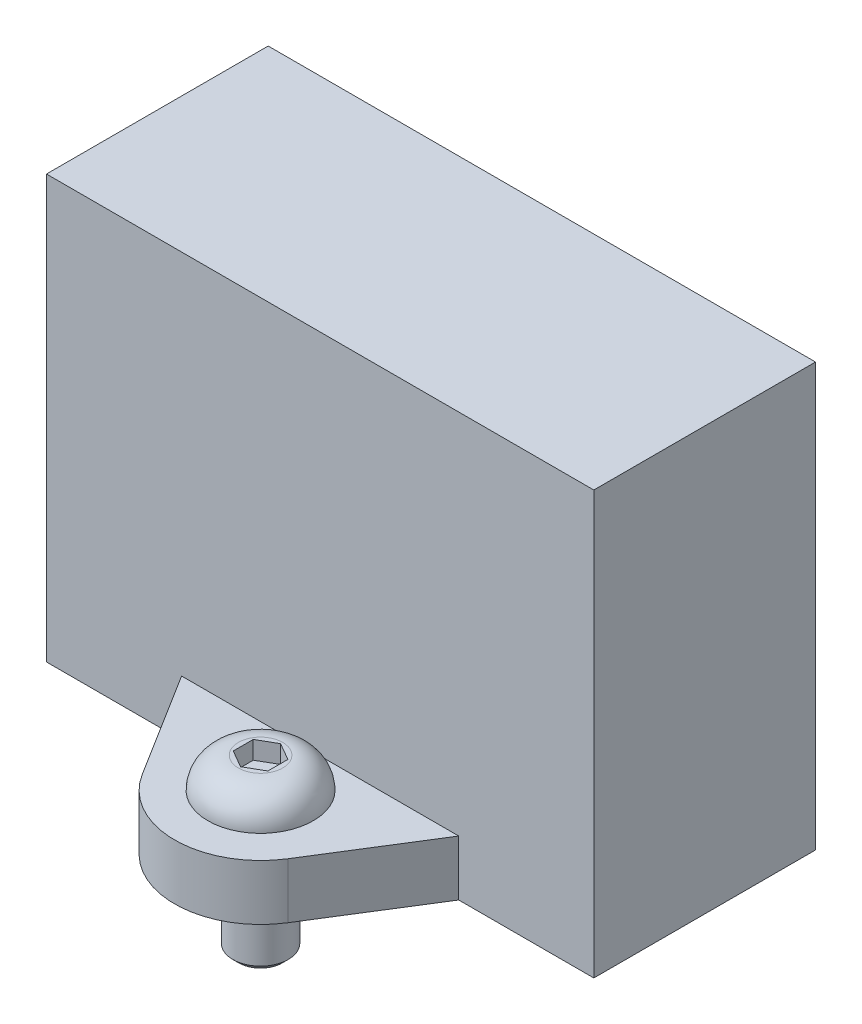
ISO-10303-21;
HEADER;
FILE_DESCRIPTION(('STEP AP214'),'2;1');
FILE_NAME('part.step','',(''),(''),'','','');
FILE_SCHEMA(('AUTOMOTIVE_DESIGN { 1 0 10303 214 1 1 1 1 }'));
ENDSEC;
DATA;
#1=APPLICATION_CONTEXT('core data for automotive mechanical design processes');
#2=APPLICATION_PROTOCOL_DEFINITION('international standard','automotive_design',2000,#1);
#3=PRODUCT_CONTEXT('',#1,'mechanical');
#4=PRODUCT('Part','Part','',(#3));
#5=PRODUCT_RELATED_PRODUCT_CATEGORY('part','',(#4));
#6=PRODUCT_DEFINITION_FORMATION('','',#4);
#7=PRODUCT_DEFINITION_CONTEXT('part definition',#1,'design');
#8=PRODUCT_DEFINITION('design','',#6,#7);
#9=PRODUCT_DEFINITION_SHAPE('','',#8);
#10=(LENGTH_UNIT() NAMED_UNIT(*) SI_UNIT(.MILLI.,.METRE.));
#11=(NAMED_UNIT(*) PLANE_ANGLE_UNIT() SI_UNIT($,.RADIAN.));
#12=(NAMED_UNIT(*) SI_UNIT($,.STERADIAN.) SOLID_ANGLE_UNIT());
#13=UNCERTAINTY_MEASURE_WITH_UNIT(LENGTH_MEASURE(1.E-05),#10,'distance_accuracy_value','');
#14=(GEOMETRIC_REPRESENTATION_CONTEXT(3) GLOBAL_UNCERTAINTY_ASSIGNED_CONTEXT((#13)) GLOBAL_UNIT_ASSIGNED_CONTEXT((#10,
#11,#12)) REPRESENTATION_CONTEXT('',''));
#15=CARTESIAN_POINT('',(0.,0.,0.));
#16=DIRECTION('',(0.,0.,1.));
#17=DIRECTION('',(1.,0.,0.));
#18=AXIS2_PLACEMENT_3D('',#15,#16,#17);
#19=CARTESIAN_POINT('',(0.,4.,4.3));
#20=DIRECTION('',(0.,1.,0.));
#21=DIRECTION('',(0.,0.,1.));
#22=AXIS2_PLACEMENT_3D('',#19,#20,#21);
#23=PLANE('',#22);
#24=DIRECTION('',(-1.,0.,0.));
#25=VECTOR('',#24,1.);
#26=CARTESIAN_POINT('',(10.,4.,0.));
#27=LINE('',#26,#25);
#28=CARTESIAN_POINT('',(10.,4.,0.));
#29=VERTEX_POINT('',#28);
#30=CARTESIAN_POINT('',(-10.,4.,0.));
#31=VERTEX_POINT('',#30);
#32=EDGE_CURVE('E218',#29,#31,#27,.T.);
#33=ORIENTED_EDGE('',*,*,#32,.T.);
#34=DIRECTION('',(0.530092544381419,0.,0.84793979408401));
#35=VECTOR('',#34,1.);
#36=CARTESIAN_POINT('',(-10.,4.,0.));
#37=LINE('',#36,#35);
#38=CARTESIAN_POINT('',(-5.25722672332086,4.,7.5865737751648));
#39=VERTEX_POINT('',#38);
#40=EDGE_CURVE('E221',#31,#39,#37,.T.);
#41=ORIENTED_EDGE('',*,*,#40,.T.);
#42=CARTESIAN_POINT('',(0.,4.,4.3));
#43=DIRECTION('',(0.,1.,0.));
#44=DIRECTION('',(0.,0.,1.));
#45=AXIS2_PLACEMENT_3D('',#42,#43,#44);
#46=CIRCLE('',#45,6.2);
#47=CARTESIAN_POINT('',(5.25722672332086,4.,7.5865737751648));
#48=VERTEX_POINT('',#47);
#49=EDGE_CURVE('E223',#39,#48,#46,.T.);
#50=ORIENTED_EDGE('',*,*,#49,.T.);
#51=DIRECTION('',(0.530092544381419,0.,-0.84793979408401));
#52=VECTOR('',#51,1.);
#53=CARTESIAN_POINT('',(5.25722672332086,4.,7.5865737751648));
#54=LINE('',#53,#52);
#55=EDGE_CURVE('E225',#48,#29,#54,.T.);
#56=ORIENTED_EDGE('',*,*,#55,.T.);
#57=EDGE_LOOP('',(#33,#41,#50,#56));
#58=FACE_BOUND('',#57,.T.);
#59=CARTESIAN_POINT('',(0.,4.,4.3));
#60=DIRECTION('',(0.,1.,0.));
#61=DIRECTION('',(0.,0.,1.));
#62=AXIS2_PLACEMENT_3D('',#59,#60,#61);
#63=CIRCLE('',#62,3.8);
#64=CARTESIAN_POINT('',(0.,4.,8.1));
#65=VERTEX_POINT('',#64);
#66=EDGE_CURVE('E205',#65,#65,#63,.T.);
#67=ORIENTED_EDGE('',*,*,#66,.F.);
#68=EDGE_LOOP('',(#67));
#69=FACE_BOUND('',#68,.T.);
#70=ADVANCED_FACE('F37',(#58,#69),#23,.T.);
#71=CARTESIAN_POINT('',(0.,0.,0.));
#72=DIRECTION('',(0.,1.,0.));
#73=DIRECTION('',(0.,0.,1.));
#74=AXIS2_PLACEMENT_3D('',#71,#72,#73);
#75=PLANE('',#74);
#76=DIRECTION('',(0.,0.,1.));
#77=VECTOR('',#76,1.);
#78=CARTESIAN_POINT('',(-19.75,0.,-16.));
#79=LINE('',#78,#77);
#80=CARTESIAN_POINT('',(-19.75,0.,-16.));
#81=VERTEX_POINT('',#80);
#82=CARTESIAN_POINT('',(-19.75,0.,0.));
#83=VERTEX_POINT('',#82);
#84=EDGE_CURVE('E247',#81,#83,#79,.T.);
#85=ORIENTED_EDGE('',*,*,#84,.F.);
#86=DIRECTION('',(-1.,0.,0.));
#87=VECTOR('',#86,1.);
#88=CARTESIAN_POINT('',(19.75,0.,-16.));
#89=LINE('',#88,#87);
#90=CARTESIAN_POINT('',(19.75,0.,-16.));
#91=VERTEX_POINT('',#90);
#92=EDGE_CURVE('E264',#91,#81,#89,.T.);
#93=ORIENTED_EDGE('',*,*,#92,.F.);
#94=DIRECTION('',(0.,0.,-1.));
#95=VECTOR('',#94,1.);
#96=CARTESIAN_POINT('',(19.75,0.,0.));
#97=LINE('',#96,#95);
#98=CARTESIAN_POINT('',(19.75,0.,0.));
#99=VERTEX_POINT('',#98);
#100=EDGE_CURVE('E272',#99,#91,#97,.T.);
#101=ORIENTED_EDGE('',*,*,#100,.F.);
#102=DIRECTION('',(1.,0.,0.));
#103=VECTOR('',#102,1.);
#104=CARTESIAN_POINT('',(-19.75,0.,0.));
#105=LINE('',#104,#103);
#106=CARTESIAN_POINT('',(10.,0.,0.));
#107=VERTEX_POINT('',#106);
#108=EDGE_CURVE('E237',#107,#99,#105,.T.);
#109=ORIENTED_EDGE('',*,*,#108,.F.);
#110=DIRECTION('',(0.530092544381419,0.,-0.84793979408401));
#111=VECTOR('',#110,1.);
#112=CARTESIAN_POINT('',(5.25722672332086,0.,7.5865737751648));
#113=LINE('',#112,#111);
#114=CARTESIAN_POINT('',(5.25722672332086,0.,7.5865737751648));
#115=VERTEX_POINT('',#114);
#116=EDGE_CURVE('E62',#115,#107,#113,.T.);
#117=ORIENTED_EDGE('',*,*,#116,.F.);
#118=CARTESIAN_POINT('',(0.,0.,4.3));
#119=DIRECTION('',(0.,1.,0.));
#120=DIRECTION('',(0.,0.,1.));
#121=AXIS2_PLACEMENT_3D('',#118,#119,#120);
#122=CIRCLE('',#121,6.2);
#123=CARTESIAN_POINT('',(-5.25722672332086,0.,7.5865737751648));
#124=VERTEX_POINT('',#123);
#125=EDGE_CURVE('E228',#124,#115,#122,.T.);
#126=ORIENTED_EDGE('',*,*,#125,.F.);
#127=DIRECTION('',(0.530092544381419,0.,0.84793979408401));
#128=VECTOR('',#127,1.);
#129=CARTESIAN_POINT('',(-10.,0.,0.));
#130=LINE('',#129,#128);
#131=CARTESIAN_POINT('',(-10.,0.,0.));
#132=VERTEX_POINT('',#131);
#133=EDGE_CURVE('E217',#132,#124,#130,.T.);
#134=ORIENTED_EDGE('',*,*,#133,.F.);
#135=EDGE_CURVE('E275',#83,#132,#105,.T.);
#136=ORIENTED_EDGE('',*,*,#135,.F.);
#137=EDGE_LOOP('',(#85,#93,#101,#109,#117,#126,#134,#136));
#138=FACE_BOUND('',#137,.T.);
#139=CARTESIAN_POINT('',(0.,0.,4.3));
#140=DIRECTION('',(0.,1.,0.));
#141=DIRECTION('',(0.,0.,1.));
#142=AXIS2_PLACEMENT_3D('',#139,#140,#141);
#143=CIRCLE('',#142,2.15);
#144=CARTESIAN_POINT('',(0.,0.,6.45));
#145=VERTEX_POINT('',#144);
#146=EDGE_CURVE('E214',#145,#145,#143,.T.);
#147=ORIENTED_EDGE('',*,*,#146,.T.);
#148=EDGE_LOOP('',(#147));
#149=FACE_BOUND('',#148,.T.);
#150=ADVANCED_FACE('F297',(#138,#149),#75,.F.);
#151=CARTESIAN_POINT('',(-19.75,30.5,0.));
#152=DIRECTION('',(0.,0.,-1.));
#153=DIRECTION('',(-1.,0.,0.));
#154=AXIS2_PLACEMENT_3D('',#151,#152,#153);
#155=PLANE('',#154);
#156=DIRECTION('',(0.,-1.,0.));
#157=VECTOR('',#156,1.);
#158=CARTESIAN_POINT('',(-10.,4.,0.));
#159=LINE('',#158,#157);
#160=EDGE_CURVE('E245',#31,#132,#159,.T.);
#161=ORIENTED_EDGE('',*,*,#160,.F.);
#162=ORIENTED_EDGE('',*,*,#32,.F.);
#163=DIRECTION('',(0.,-1.,0.));
#164=VECTOR('',#163,1.);
#165=CARTESIAN_POINT('',(10.,4.,0.));
#166=LINE('',#165,#164);
#167=EDGE_CURVE('E227',#29,#107,#166,.T.);
#168=ORIENTED_EDGE('',*,*,#167,.T.);
#169=ORIENTED_EDGE('',*,*,#108,.T.);
#170=DIRECTION('',(0.,-1.,0.));
#171=VECTOR('',#170,1.);
#172=CARTESIAN_POINT('',(19.75,30.5,0.));
#173=LINE('',#172,#171);
#174=CARTESIAN_POINT('',(19.75,30.5,0.));
#175=VERTEX_POINT('',#174);
#176=EDGE_CURVE('E46',#175,#99,#173,.T.);
#177=ORIENTED_EDGE('',*,*,#176,.F.);
#178=DIRECTION('',(1.,0.,0.));
#179=VECTOR('',#178,1.);
#180=CARTESIAN_POINT('',(-19.75,30.5,0.));
#181=LINE('',#180,#179);
#182=CARTESIAN_POINT('',(-19.75,30.5,0.));
#183=VERTEX_POINT('',#182);
#184=EDGE_CURVE('E263',#183,#175,#181,.T.);
#185=ORIENTED_EDGE('',*,*,#184,.F.);
#186=DIRECTION('',(0.,-1.,0.));
#187=VECTOR('',#186,1.);
#188=CARTESIAN_POINT('',(-19.75,30.5,0.));
#189=LINE('',#188,#187);
#190=EDGE_CURVE('E11',#183,#83,#189,.T.);
#191=ORIENTED_EDGE('',*,*,#190,.T.);
#192=ORIENTED_EDGE('',*,*,#135,.T.);
#193=EDGE_LOOP('',(#161,#162,#168,#169,#177,#185,#191,#192));
#194=FACE_BOUND('',#193,.T.);
#195=ADVANCED_FACE('F305',(#194),#155,.F.);
#196=CARTESIAN_POINT('',(-19.75,30.5,-16.));
#197=DIRECTION('',(1.,0.,0.));
#198=DIRECTION('',(0.,0.,-1.));
#199=AXIS2_PLACEMENT_3D('',#196,#197,#198);
#200=PLANE('',#199);
#201=ORIENTED_EDGE('',*,*,#84,.T.);
#202=ORIENTED_EDGE('',*,*,#190,.F.);
#203=DIRECTION('',(0.,0.,1.));
#204=VECTOR('',#203,1.);
#205=CARTESIAN_POINT('',(-19.75,30.5,-16.));
#206=LINE('',#205,#204);
#207=CARTESIAN_POINT('',(-19.75,30.5,-16.));
#208=VERTEX_POINT('',#207);
#209=EDGE_CURVE('E260',#208,#183,#206,.T.);
#210=ORIENTED_EDGE('',*,*,#209,.F.);
#211=DIRECTION('',(0.,-1.,0.));
#212=VECTOR('',#211,1.);
#213=CARTESIAN_POINT('',(-19.75,30.5,-16.));
#214=LINE('',#213,#212);
#215=EDGE_CURVE('E269',#208,#81,#214,.T.);
#216=ORIENTED_EDGE('',*,*,#215,.T.);
#217=EDGE_LOOP('',(#201,#202,#210,#216));
#218=FACE_BOUND('',#217,.T.);
#219=ADVANCED_FACE('F39',(#218),#200,.F.);
#220=CARTESIAN_POINT('',(19.75,30.5,0.));
#221=DIRECTION('',(-1.,0.,0.));
#222=DIRECTION('',(0.,0.,1.));
#223=AXIS2_PLACEMENT_3D('',#220,#221,#222);
#224=PLANE('',#223);
#225=ORIENTED_EDGE('',*,*,#100,.T.);
#226=DIRECTION('',(0.,-1.,0.));
#227=VECTOR('',#226,1.);
#228=CARTESIAN_POINT('',(19.75,30.5,-16.));
#229=LINE('',#228,#227);
#230=CARTESIAN_POINT('',(19.75,30.5,-16.));
#231=VERTEX_POINT('',#230);
#232=EDGE_CURVE('E279',#231,#91,#229,.T.);
#233=ORIENTED_EDGE('',*,*,#232,.F.);
#234=DIRECTION('',(0.,0.,-1.));
#235=VECTOR('',#234,1.);
#236=CARTESIAN_POINT('',(19.75,30.5,0.));
#237=LINE('',#236,#235);
#238=EDGE_CURVE('E266',#175,#231,#237,.T.);
#239=ORIENTED_EDGE('',*,*,#238,.F.);
#240=ORIENTED_EDGE('',*,*,#176,.T.);
#241=EDGE_LOOP('',(#225,#233,#239,#240));
#242=FACE_BOUND('',#241,.T.);
#243=ADVANCED_FACE('F289',(#242),#224,.F.);
#244=CARTESIAN_POINT('',(19.75,30.5,-16.));
#245=DIRECTION('',(0.,0.,1.));
#246=DIRECTION('',(1.,0.,0.));
#247=AXIS2_PLACEMENT_3D('',#244,#245,#246);
#248=PLANE('',#247);
#249=ORIENTED_EDGE('',*,*,#92,.T.);
#250=ORIENTED_EDGE('',*,*,#215,.F.);
#251=DIRECTION('',(-1.,0.,0.));
#252=VECTOR('',#251,1.);
#253=CARTESIAN_POINT('',(19.75,30.5,-16.));
#254=LINE('',#253,#252);
#255=EDGE_CURVE('E268',#231,#208,#254,.T.);
#256=ORIENTED_EDGE('',*,*,#255,.F.);
#257=ORIENTED_EDGE('',*,*,#232,.T.);
#258=EDGE_LOOP('',(#249,#250,#256,#257));
#259=FACE_BOUND('',#258,.T.);
#260=ADVANCED_FACE('F295',(#259),#248,.F.);
#261=CARTESIAN_POINT('',(0.,30.5,0.));
#262=DIRECTION('',(0.,1.,0.));
#263=DIRECTION('',(0.,0.,1.));
#264=AXIS2_PLACEMENT_3D('',#261,#262,#263);
#265=PLANE('',#264);
#266=ORIENTED_EDGE('',*,*,#209,.T.);
#267=ORIENTED_EDGE('',*,*,#184,.T.);
#268=ORIENTED_EDGE('',*,*,#238,.T.);
#269=ORIENTED_EDGE('',*,*,#255,.T.);
#270=EDGE_LOOP('',(#266,#267,#268,#269));
#271=FACE_BOUND('',#270,.T.);
#272=ADVANCED_FACE('F303',(#271),#265,.T.);
#273=CARTESIAN_POINT('',(-10.,4.,0.));
#274=DIRECTION('',(0.84793979408401,0.,-0.530092544381419));
#275=DIRECTION('',(-0.530092544381419,0.,-0.84793979408401));
#276=AXIS2_PLACEMENT_3D('',#273,#274,#275);
#277=PLANE('',#276);
#278=ORIENTED_EDGE('',*,*,#133,.T.);
#279=DIRECTION('',(0.,-1.,0.));
#280=VECTOR('',#279,1.);
#281=CARTESIAN_POINT('',(-5.25722672332086,4.,7.5865737751648));
#282=LINE('',#281,#280);
#283=EDGE_CURVE('E248',#39,#124,#282,.T.);
#284=ORIENTED_EDGE('',*,*,#283,.F.);
#285=ORIENTED_EDGE('',*,*,#40,.F.);
#286=ORIENTED_EDGE('',*,*,#160,.T.);
#287=EDGE_LOOP('',(#278,#284,#285,#286));
#288=FACE_BOUND('',#287,.T.);
#289=ADVANCED_FACE('F313',(#288),#277,.F.);
#290=CARTESIAN_POINT('',(0.,4.,4.3));
#291=DIRECTION('',(0.,-1.,0.));
#292=DIRECTION('',(0.,0.,-1.));
#293=AXIS2_PLACEMENT_3D('',#290,#291,#292);
#294=CYLINDRICAL_SURFACE('',#293,6.2);
#295=ORIENTED_EDGE('',*,*,#125,.T.);
#296=DIRECTION('',(0.,-1.,0.));
#297=VECTOR('',#296,1.);
#298=CARTESIAN_POINT('',(5.25722672332086,4.,7.5865737751648));
#299=LINE('',#298,#297);
#300=EDGE_CURVE('E232',#48,#115,#299,.T.);
#301=ORIENTED_EDGE('',*,*,#300,.F.);
#302=ORIENTED_EDGE('',*,*,#49,.F.);
#303=ORIENTED_EDGE('',*,*,#283,.T.);
#304=EDGE_LOOP('',(#295,#301,#302,#303));
#305=FACE_BOUND('',#304,.T.);
#306=ADVANCED_FACE('F308',(#305),#294,.T.);
#307=CARTESIAN_POINT('',(5.25722672332086,4.,7.5865737751648));
#308=DIRECTION('',(-0.84793979408401,0.,-0.530092544381419));
#309=DIRECTION('',(-0.530092544381419,0.,0.84793979408401));
#310=AXIS2_PLACEMENT_3D('',#307,#308,#309);
#311=PLANE('',#310);
#312=ORIENTED_EDGE('',*,*,#116,.T.);
#313=ORIENTED_EDGE('',*,*,#167,.F.);
#314=ORIENTED_EDGE('',*,*,#55,.F.);
#315=ORIENTED_EDGE('',*,*,#300,.T.);
#316=EDGE_LOOP('',(#312,#313,#314,#315));
#317=FACE_BOUND('',#316,.T.);
#318=ADVANCED_FACE('F310',(#317),#311,.F.);
#319=CARTESIAN_POINT('',(0.,0.,4.3));
#320=DIRECTION('',(0.,1.,0.));
#321=DIRECTION('',(0.,0.,1.));
#322=AXIS2_PLACEMENT_3D('',#319,#320,#321);
#323=CYLINDRICAL_SURFACE('',#322,2.15);
#324=CARTESIAN_POINT('',(0.,4.,4.3));
#325=DIRECTION('',(0.,1.,0.));
#326=DIRECTION('',(0.,0.,1.));
#327=AXIS2_PLACEMENT_3D('',#324,#325,#326);
#328=CIRCLE('',#327,2.15);
#329=CARTESIAN_POINT('',(0.,4.,6.45));
#330=VERTEX_POINT('',#329);
#331=EDGE_CURVE('E211',#330,#330,#328,.T.);
#332=ORIENTED_EDGE('',*,*,#331,.T.);
#333=EDGE_LOOP('',(#332));
#334=FACE_BOUND('',#333,.T.);
#335=ORIENTED_EDGE('',*,*,#146,.F.);
#336=EDGE_LOOP('',(#335));
#337=FACE_BOUND('',#336,.T.);
#338=ADVANCED_FACE('F330',(#334,#337),#323,.F.);
#339=CARTESIAN_POINT('',(1.5705,-6.,4.3));
#340=DIRECTION('',(0.,1.,0.));
#341=DIRECTION('',(0.,0.,1.));
#342=AXIS2_PLACEMENT_3D('',#339,#340,#341);
#343=PLANE('',#342);
#344=CARTESIAN_POINT('',(0.,-6.,4.3));
#345=DIRECTION('',(0.,1.,0.));
#346=DIRECTION('',(0.,0.,1.));
#347=AXIS2_PLACEMENT_3D('',#344,#345,#346);
#348=CIRCLE('',#347,1.5705);
#349=CARTESIAN_POINT('',(0.,-6.,5.8705));
#350=VERTEX_POINT('',#349);
#351=EDGE_CURVE('E189',#350,#350,#348,.T.);
#352=ORIENTED_EDGE('',*,*,#351,.F.);
#353=EDGE_LOOP('',(#352));
#354=FACE_BOUND('',#353,.T.);
#355=ADVANCED_FACE('F336',(#354),#343,.F.);
#356=CARTESIAN_POINT('',(0.,-6.,4.3));
#357=DIRECTION('',(0.,1.,0.));
#358=DIRECTION('',(0.,0.,1.));
#359=AXIS2_PLACEMENT_3D('',#356,#357,#358);
#360=CONICAL_SURFACE('',#359,1.5705,0.785398163397447);
#361=CARTESIAN_POINT('',(0.,-5.5705,4.3));
#362=DIRECTION('',(0.,1.,0.));
#363=DIRECTION('',(0.,0.,1.));
#364=AXIS2_PLACEMENT_3D('',#361,#362,#363);
#365=CIRCLE('',#364,2.);
#366=CARTESIAN_POINT('',(0.,-5.5705,6.3));
#367=VERTEX_POINT('',#366);
#368=EDGE_CURVE('E199',#367,#367,#365,.T.);
#369=ORIENTED_EDGE('',*,*,#368,.F.);
#370=EDGE_LOOP('',(#369));
#371=FACE_BOUND('',#370,.T.);
#372=ORIENTED_EDGE('',*,*,#351,.T.);
#373=EDGE_LOOP('',(#372));
#374=FACE_BOUND('',#373,.T.);
#375=ADVANCED_FACE('F341',(#371,#374),#360,.T.);
#376=CARTESIAN_POINT('',(0.,-6.,4.3));
#377=DIRECTION('',(0.,1.,0.));
#378=DIRECTION('',(0.,0.,1.));
#379=AXIS2_PLACEMENT_3D('',#376,#377,#378);
#380=CYLINDRICAL_SURFACE('',#379,2.);
#381=CARTESIAN_POINT('',(0.,4.,4.3));
#382=DIRECTION('',(0.,1.,0.));
#383=DIRECTION('',(0.,0.,1.));
#384=AXIS2_PLACEMENT_3D('',#381,#382,#383);
#385=CIRCLE('',#384,2.);
#386=CARTESIAN_POINT('',(0.,4.,6.3));
#387=VERTEX_POINT('',#386);
#388=EDGE_CURVE('E202',#387,#387,#385,.T.);
#389=ORIENTED_EDGE('',*,*,#388,.F.);
#390=EDGE_LOOP('',(#389));
#391=FACE_BOUND('',#390,.T.);
#392=ORIENTED_EDGE('',*,*,#368,.T.);
#393=EDGE_LOOP('',(#392));
#394=FACE_BOUND('',#393,.T.);
#395=ADVANCED_FACE('F352',(#391,#394),#380,.T.);
#396=CARTESIAN_POINT('',(3.8,4.,4.3));
#397=DIRECTION('',(0.,1.,0.));
#398=DIRECTION('',(0.,0.,1.));
#399=AXIS2_PLACEMENT_3D('',#396,#397,#398);
#400=PLANE('',#399);
#401=ORIENTED_EDGE('',*,*,#331,.F.);
#402=EDGE_LOOP('',(#401));
#403=FACE_BOUND('',#402,.T.);
#404=ORIENTED_EDGE('',*,*,#388,.T.);
#405=EDGE_LOOP('',(#404));
#406=FACE_BOUND('',#405,.T.);
#407=ADVANCED_FACE('F348',(#403,#406),#400,.F.);
#408=CARTESIAN_POINT('',(0.,6.2,4.3));
#409=DIRECTION('',(0.,-1.,0.));
#410=DIRECTION('',(0.,0.,-1.));
#411=AXIS2_PLACEMENT_3D('',#408,#409,#410);
#412=PLANE('',#411);
#413=DIRECTION('',(0.,0.,1.));
#414=VECTOR('',#413,1.);
#415=CARTESIAN_POINT('',(-1.25,6.2,3.57831216351297));
#416=LINE('',#415,#414);
#417=CARTESIAN_POINT('',(-1.25,6.2,3.57831216351297));
#418=VERTEX_POINT('',#417);
#419=CARTESIAN_POINT('',(-1.25,6.2,5.02168783648703));
#420=VERTEX_POINT('',#419);
#421=EDGE_CURVE('E177',#418,#420,#416,.T.);
#422=ORIENTED_EDGE('',*,*,#421,.F.);
#423=DIRECTION('',(-0.866025403784439,0.,0.5));
#424=VECTOR('',#423,1.);
#425=CARTESIAN_POINT('',(0.,6.2,2.85662432702594));
#426=LINE('',#425,#424);
#427=CARTESIAN_POINT('',(0.,6.2,2.85662432702594));
#428=VERTEX_POINT('',#427);
#429=EDGE_CURVE('E54',#428,#418,#426,.T.);
#430=ORIENTED_EDGE('',*,*,#429,.F.);
#431=DIRECTION('',(-0.866025403784439,0.,-0.5));
#432=VECTOR('',#431,1.);
#433=CARTESIAN_POINT('',(1.25,6.2,3.57831216351297));
#434=LINE('',#433,#432);
#435=CARTESIAN_POINT('',(1.25,6.2,3.57831216351297));
#436=VERTEX_POINT('',#435);
#437=EDGE_CURVE('E163',#436,#428,#434,.T.);
#438=ORIENTED_EDGE('',*,*,#437,.F.);
#439=DIRECTION('',(0.,0.,-1.));
#440=VECTOR('',#439,1.);
#441=CARTESIAN_POINT('',(1.25,6.2,5.02168783648703));
#442=LINE('',#441,#440);
#443=CARTESIAN_POINT('',(1.25,6.2,5.02168783648703));
#444=VERTEX_POINT('',#443);
#445=EDGE_CURVE('E166',#444,#436,#442,.T.);
#446=ORIENTED_EDGE('',*,*,#445,.F.);
#447=DIRECTION('',(0.866025403784439,0.,-0.5));
#448=VECTOR('',#447,1.);
#449=CARTESIAN_POINT('',(0.,6.2,5.74337567297406));
#450=LINE('',#449,#448);
#451=CARTESIAN_POINT('',(0.,6.2,5.74337567297406));
#452=VERTEX_POINT('',#451);
#453=EDGE_CURVE('E182',#452,#444,#450,.T.);
#454=ORIENTED_EDGE('',*,*,#453,.F.);
#455=DIRECTION('',(0.866025403784439,0.,0.5));
#456=VECTOR('',#455,1.);
#457=CARTESIAN_POINT('',(-1.25,6.2,5.02168783648703));
#458=LINE('',#457,#456);
#459=EDGE_CURVE('E179',#420,#452,#458,.T.);
#460=ORIENTED_EDGE('',*,*,#459,.F.);
#461=EDGE_LOOP('',(#422,#430,#438,#446,#454,#460));
#462=FACE_BOUND('',#461,.T.);
#463=CARTESIAN_POINT('',(0.,6.2,4.3));
#464=DIRECTION('',(0.,1.,0.));
#465=DIRECTION('',(0.,0.,1.));
#466=AXIS2_PLACEMENT_3D('',#463,#464,#465);
#467=CIRCLE('',#466,1.6);
#468=CARTESIAN_POINT('',(0.,6.2,5.9));
#469=VERTEX_POINT('',#468);
#470=EDGE_CURVE('E208',#469,#469,#467,.T.);
#471=ORIENTED_EDGE('',*,*,#470,.T.);
#472=EDGE_LOOP('',(#471));
#473=FACE_BOUND('',#472,.T.);
#474=ADVANCED_FACE('F351',(#462,#473),#412,.F.);
#475=CARTESIAN_POINT('',(0.,4.,4.3));
#476=DIRECTION('',(0.,1.,0.));
#477=DIRECTION('',(0.,0.,1.));
#478=AXIS2_PLACEMENT_3D('',#475,#476,#477);
#479=DEGENERATE_TOROIDAL_SURFACE('',#478,1.6,2.2,.T.);
#480=ORIENTED_EDGE('',*,*,#470,.F.);
#481=EDGE_LOOP('',(#480));
#482=FACE_BOUND('',#481,.T.);
#483=ORIENTED_EDGE('',*,*,#66,.T.);
#484=EDGE_LOOP('',(#483));
#485=FACE_BOUND('',#484,.T.);
#486=ADVANCED_FACE('F369',(#482,#485),#479,.T.);
#487=CARTESIAN_POINT('',(0.,4.9,2.85662432702594));
#488=DIRECTION('',(-0.5,0.,-0.866025403784439));
#489=DIRECTION('',(-0.866025403784439,0.,0.5));
#490=AXIS2_PLACEMENT_3D('',#487,#488,#489);
#491=PLANE('',#490);
#492=ORIENTED_EDGE('',*,*,#429,.T.);
#493=DIRECTION('',(0.,1.,0.));
#494=VECTOR('',#493,1.);
#495=CARTESIAN_POINT('',(-1.25,4.9,3.57831216351297));
#496=LINE('',#495,#494);
#497=CARTESIAN_POINT('',(-1.25,4.9,3.57831216351297));
#498=VERTEX_POINT('',#497);
#499=EDGE_CURVE('E140',#498,#418,#496,.T.);
#500=ORIENTED_EDGE('',*,*,#499,.F.);
#501=DIRECTION('',(-0.866025403784439,0.,0.5));
#502=VECTOR('',#501,1.);
#503=CARTESIAN_POINT('',(0.,4.9,2.85662432702594));
#504=LINE('',#503,#502);
#505=CARTESIAN_POINT('',(0.,4.9,2.85662432702594));
#506=VERTEX_POINT('',#505);
#507=EDGE_CURVE('E144',#506,#498,#504,.T.);
#508=ORIENTED_EDGE('',*,*,#507,.F.);
#509=DIRECTION('',(0.,1.,0.));
#510=VECTOR('',#509,1.);
#511=CARTESIAN_POINT('',(0.,4.9,2.85662432702594));
#512=LINE('',#511,#510);
#513=EDGE_CURVE('E187',#506,#428,#512,.T.);
#514=ORIENTED_EDGE('',*,*,#513,.T.);
#515=EDGE_LOOP('',(#492,#500,#508,#514));
#516=FACE_BOUND('',#515,.T.);
#517=ADVANCED_FACE('F142',(#516),#491,.F.);
#518=CARTESIAN_POINT('',(1.25,4.9,3.57831216351297));
#519=DIRECTION('',(0.5,0.,-0.866025403784439));
#520=DIRECTION('',(-0.866025403784439,0.,-0.5));
#521=AXIS2_PLACEMENT_3D('',#518,#519,#520);
#522=PLANE('',#521);
#523=ORIENTED_EDGE('',*,*,#437,.T.);
#524=ORIENTED_EDGE('',*,*,#513,.F.);
#525=DIRECTION('',(-0.866025403784439,0.,-0.5));
#526=VECTOR('',#525,1.);
#527=CARTESIAN_POINT('',(1.25,4.9,3.57831216351297));
#528=LINE('',#527,#526);
#529=CARTESIAN_POINT('',(1.25,4.9,3.57831216351297));
#530=VERTEX_POINT('',#529);
#531=EDGE_CURVE('E150',#530,#506,#528,.T.);
#532=ORIENTED_EDGE('',*,*,#531,.F.);
#533=DIRECTION('',(0.,1.,0.));
#534=VECTOR('',#533,1.);
#535=CARTESIAN_POINT('',(1.25,4.9,3.57831216351297));
#536=LINE('',#535,#534);
#537=EDGE_CURVE('E190',#530,#436,#536,.T.);
#538=ORIENTED_EDGE('',*,*,#537,.T.);
#539=EDGE_LOOP('',(#523,#524,#532,#538));
#540=FACE_BOUND('',#539,.T.);
#541=ADVANCED_FACE('F393',(#540),#522,.F.);
#542=CARTESIAN_POINT('',(1.25,4.9,5.02168783648703));
#543=DIRECTION('',(1.,0.,0.));
#544=DIRECTION('',(0.,0.,-1.));
#545=AXIS2_PLACEMENT_3D('',#542,#543,#544);
#546=PLANE('',#545);
#547=ORIENTED_EDGE('',*,*,#445,.T.);
#548=ORIENTED_EDGE('',*,*,#537,.F.);
#549=DIRECTION('',(0.,0.,-1.));
#550=VECTOR('',#549,1.);
#551=CARTESIAN_POINT('',(1.25,4.9,5.02168783648703));
#552=LINE('',#551,#550);
#553=CARTESIAN_POINT('',(1.25,4.9,5.02168783648703));
#554=VERTEX_POINT('',#553);
#555=EDGE_CURVE('E173',#554,#530,#552,.T.);
#556=ORIENTED_EDGE('',*,*,#555,.F.);
#557=DIRECTION('',(0.,1.,0.));
#558=VECTOR('',#557,1.);
#559=CARTESIAN_POINT('',(1.25,4.9,5.02168783648703));
#560=LINE('',#559,#558);
#561=EDGE_CURVE('E192',#554,#444,#560,.T.);
#562=ORIENTED_EDGE('',*,*,#561,.T.);
#563=EDGE_LOOP('',(#547,#548,#556,#562));
#564=FACE_BOUND('',#563,.T.);
#565=ADVANCED_FACE('F391',(#564),#546,.F.);
#566=CARTESIAN_POINT('',(0.,4.9,5.74337567297406));
#567=DIRECTION('',(0.5,0.,0.866025403784439));
#568=DIRECTION('',(0.866025403784439,0.,-0.5));
#569=AXIS2_PLACEMENT_3D('',#566,#567,#568);
#570=PLANE('',#569);
#571=ORIENTED_EDGE('',*,*,#453,.T.);
#572=ORIENTED_EDGE('',*,*,#561,.F.);
#573=DIRECTION('',(0.866025403784439,0.,-0.5));
#574=VECTOR('',#573,1.);
#575=CARTESIAN_POINT('',(0.,4.9,5.74337567297406));
#576=LINE('',#575,#574);
#577=CARTESIAN_POINT('',(0.,4.9,5.74337567297406));
#578=VERTEX_POINT('',#577);
#579=EDGE_CURVE('E170',#578,#554,#576,.T.);
#580=ORIENTED_EDGE('',*,*,#579,.F.);
#581=DIRECTION('',(0.,1.,0.));
#582=VECTOR('',#581,1.);
#583=CARTESIAN_POINT('',(0.,4.9,5.74337567297406));
#584=LINE('',#583,#582);
#585=EDGE_CURVE('E194',#578,#452,#584,.T.);
#586=ORIENTED_EDGE('',*,*,#585,.T.);
#587=EDGE_LOOP('',(#571,#572,#580,#586));
#588=FACE_BOUND('',#587,.T.);
#589=ADVANCED_FACE('F389',(#588),#570,.F.);
#590=CARTESIAN_POINT('',(-1.25,4.9,5.02168783648703));
#591=DIRECTION('',(-0.5,0.,0.866025403784439));
#592=DIRECTION('',(0.866025403784439,0.,0.5));
#593=AXIS2_PLACEMENT_3D('',#590,#591,#592);
#594=PLANE('',#593);
#595=ORIENTED_EDGE('',*,*,#459,.T.);
#596=ORIENTED_EDGE('',*,*,#585,.F.);
#597=DIRECTION('',(0.866025403784439,0.,0.5));
#598=VECTOR('',#597,1.);
#599=CARTESIAN_POINT('',(-1.25,4.9,5.02168783648703));
#600=LINE('',#599,#598);
#601=CARTESIAN_POINT('',(-1.25,4.9,5.02168783648703));
#602=VERTEX_POINT('',#601);
#603=EDGE_CURVE('E158',#602,#578,#600,.T.);
#604=ORIENTED_EDGE('',*,*,#603,.F.);
#605=DIRECTION('',(0.,1.,0.));
#606=VECTOR('',#605,1.);
#607=CARTESIAN_POINT('',(-1.25,4.9,5.02168783648703));
#608=LINE('',#607,#606);
#609=EDGE_CURVE('E149',#602,#420,#608,.T.);
#610=ORIENTED_EDGE('',*,*,#609,.T.);
#611=EDGE_LOOP('',(#595,#596,#604,#610));
#612=FACE_BOUND('',#611,.T.);
#613=ADVANCED_FACE('F385',(#612),#594,.F.);
#614=CARTESIAN_POINT('',(-1.25,4.9,3.57831216351297));
#615=DIRECTION('',(-1.,0.,0.));
#616=DIRECTION('',(0.,0.,1.));
#617=AXIS2_PLACEMENT_3D('',#614,#615,#616);
#618=PLANE('',#617);
#619=ORIENTED_EDGE('',*,*,#421,.T.);
#620=ORIENTED_EDGE('',*,*,#609,.F.);
#621=DIRECTION('',(0.,0.,1.));
#622=VECTOR('',#621,1.);
#623=CARTESIAN_POINT('',(-1.25,4.9,3.57831216351297));
#624=LINE('',#623,#622);
#625=EDGE_CURVE('E153',#498,#602,#624,.T.);
#626=ORIENTED_EDGE('',*,*,#625,.F.);
#627=ORIENTED_EDGE('',*,*,#499,.T.);
#628=EDGE_LOOP('',(#619,#620,#626,#627));
#629=FACE_BOUND('',#628,.T.);
#630=ADVANCED_FACE('F154',(#629),#618,.F.);
#631=CARTESIAN_POINT('',(0.,4.9,0.));
#632=DIRECTION('',(0.,1.,0.));
#633=DIRECTION('',(0.,0.,1.));
#634=AXIS2_PLACEMENT_3D('',#631,#632,#633);
#635=PLANE('',#634);
#636=ORIENTED_EDGE('',*,*,#507,.T.);
#637=ORIENTED_EDGE('',*,*,#625,.T.);
#638=ORIENTED_EDGE('',*,*,#603,.T.);
#639=ORIENTED_EDGE('',*,*,#579,.T.);
#640=ORIENTED_EDGE('',*,*,#555,.T.);
#641=ORIENTED_EDGE('',*,*,#531,.T.);
#642=EDGE_LOOP('',(#636,#637,#638,#639,#640,#641));
#643=FACE_BOUND('',#642,.T.);
#644=ADVANCED_FACE('F160',(#643),#635,.T.);
#645=CLOSED_SHELL('',(#70,#150,#195,#219,#243,#260,#272,#289,#306,#318,#338,#355,#375,#395,#407,
#474,#486,#517,#541,#565,#589,#613,#630,#644));
#646=MANIFOLD_SOLID_BREP('B2',#645);
#647=ADVANCED_BREP_SHAPE_REPRESENTATION('',(#18,#646),#14);
#648=SHAPE_DEFINITION_REPRESENTATION(#9,#647);
ENDSEC;
END-ISO-10303-21;
